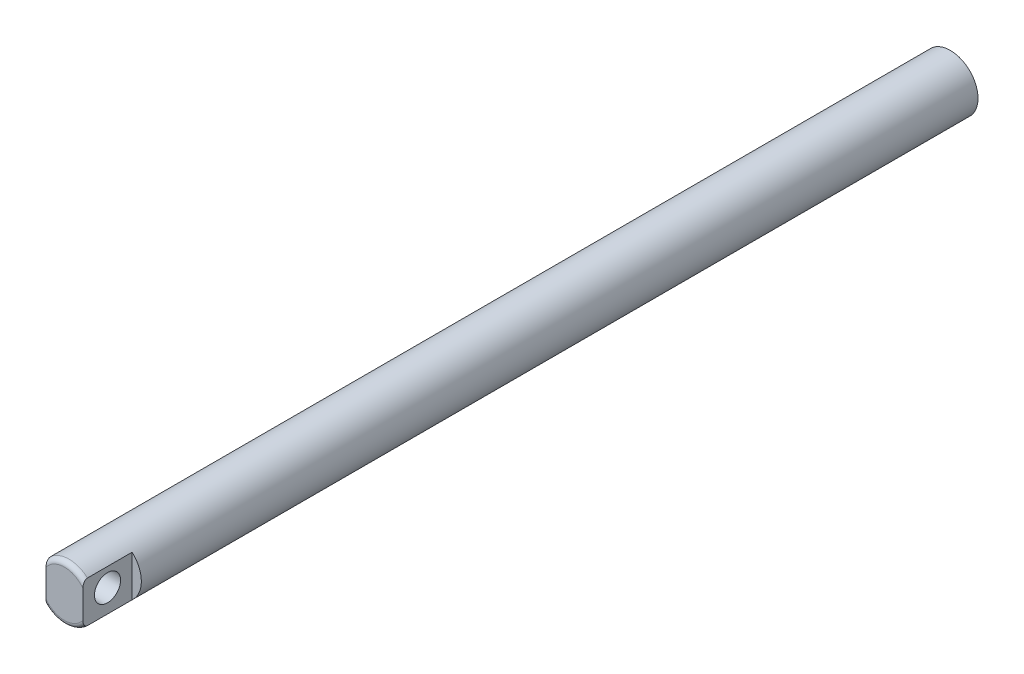
ISO-10303-21;
HEADER;
FILE_DESCRIPTION(('STEP AP214'),'2;1');
FILE_NAME('part.step','',(''),(''),'','','');
FILE_SCHEMA(('AUTOMOTIVE_DESIGN { 1 0 10303 214 1 1 1 1 }'));
ENDSEC;
DATA;
#1=APPLICATION_CONTEXT('core data for automotive mechanical design processes');
#2=APPLICATION_PROTOCOL_DEFINITION('international standard','automotive_design',2000,#1);
#3=PRODUCT_CONTEXT('',#1,'mechanical');
#4=PRODUCT('Part','Part','',(#3));
#5=PRODUCT_RELATED_PRODUCT_CATEGORY('part','',(#4));
#6=PRODUCT_DEFINITION_FORMATION('','',#4);
#7=PRODUCT_DEFINITION_CONTEXT('part definition',#1,'design');
#8=PRODUCT_DEFINITION('design','',#6,#7);
#9=PRODUCT_DEFINITION_SHAPE('','',#8);
#10=(LENGTH_UNIT() NAMED_UNIT(*) SI_UNIT(.MILLI.,.METRE.));
#11=(NAMED_UNIT(*) PLANE_ANGLE_UNIT() SI_UNIT($,.RADIAN.));
#12=(NAMED_UNIT(*) SI_UNIT($,.STERADIAN.) SOLID_ANGLE_UNIT());
#13=UNCERTAINTY_MEASURE_WITH_UNIT(LENGTH_MEASURE(1.E-05),#10,'distance_accuracy_value','');
#14=(GEOMETRIC_REPRESENTATION_CONTEXT(3) GLOBAL_UNCERTAINTY_ASSIGNED_CONTEXT((#13)) GLOBAL_UNIT_ASSIGNED_CONTEXT((#10,
#11,#12)) REPRESENTATION_CONTEXT('',''));
#15=CARTESIAN_POINT('',(0.,0.,0.));
#16=DIRECTION('',(0.,0.,1.));
#17=DIRECTION('',(1.,0.,0.));
#18=AXIS2_PLACEMENT_3D('',#15,#16,#17);
#19=CARTESIAN_POINT('',(0.,0.,144.));
#20=DIRECTION('',(0.,0.,-1.));
#21=DIRECTION('',(-1.00000000000001,0.,0.));
#22=AXIS2_PLACEMENT_3D('',#19,#20,#21);
#23=CYLINDRICAL_SURFACE('',#22,4.5);
#24=DIRECTION('',(0.,0.,-1.));
#25=VECTOR('',#24,1.);
#26=CARTESIAN_POINT('',(3.00000000000002,-3.35410196624971,144.));
#27=LINE('',#26,#25);
#28=CARTESIAN_POINT('',(3.00000000000002,-3.35410196624971,136.));
#29=VERTEX_POINT('',#28);
#30=CARTESIAN_POINT('',(3.00000000000002,-3.35410196624971,143.25));
#31=VERTEX_POINT('',#30);
#32=EDGE_CURVE('E101',#29,#31,#27,.F.);
#33=ORIENTED_EDGE('',*,*,#32,.T.);
#34=CARTESIAN_POINT('',(0.,0.,143.25));
#35=DIRECTION('',(0.,0.,1.));
#36=DIRECTION('',(1.00000000000001,0.,0.));
#37=AXIS2_PLACEMENT_3D('',#34,#35,#36);
#38=CIRCLE('',#37,4.5);
#39=CARTESIAN_POINT('',(-3.00000000000002,-3.35410196624969,143.25));
#40=VERTEX_POINT('',#39);
#41=EDGE_CURVE('E72',#31,#40,#38,.F.);
#42=ORIENTED_EDGE('',*,*,#41,.T.);
#43=DIRECTION('',(0.,0.,-1.));
#44=VECTOR('',#43,1.);
#45=CARTESIAN_POINT('',(-3.00000000000002,-3.35410196624969,144.));
#46=LINE('',#45,#44);
#47=CARTESIAN_POINT('',(-3.00000000000002,-3.35410196624969,136.));
#48=VERTEX_POINT('',#47);
#49=EDGE_CURVE('E214',#40,#48,#46,.T.);
#50=ORIENTED_EDGE('',*,*,#49,.T.);
#51=CARTESIAN_POINT('',(0.,0.,136.));
#52=DIRECTION('',(0.,0.,-1.));
#53=DIRECTION('',(-1.00000000000001,0.,0.));
#54=AXIS2_PLACEMENT_3D('',#51,#52,#53);
#55=CIRCLE('',#54,4.5);
#56=CARTESIAN_POINT('',(-3.00000000000002,3.35410196624971,136.));
#57=VERTEX_POINT('',#56);
#58=EDGE_CURVE('E124',#48,#57,#55,.T.);
#59=ORIENTED_EDGE('',*,*,#58,.T.);
#60=DIRECTION('',(0.,0.,-1.));
#61=VECTOR('',#60,1.);
#62=CARTESIAN_POINT('',(-3.00000000000002,3.35410196624971,144.));
#63=LINE('',#62,#61);
#64=CARTESIAN_POINT('',(-3.00000000000002,3.35410196624971,143.25));
#65=VERTEX_POINT('',#64);
#66=EDGE_CURVE('E192',#57,#65,#63,.F.);
#67=ORIENTED_EDGE('',*,*,#66,.T.);
#68=CARTESIAN_POINT('',(0.,0.,143.25));
#69=DIRECTION('',(0.,0.,1.));
#70=DIRECTION('',(1.00000000000001,0.,0.));
#71=AXIS2_PLACEMENT_3D('',#68,#69,#70);
#72=CIRCLE('',#71,4.5);
#73=CARTESIAN_POINT('',(3.00000000000002,3.35410196624973,143.25));
#74=VERTEX_POINT('',#73);
#75=EDGE_CURVE('E189',#65,#74,#72,.F.);
#76=ORIENTED_EDGE('',*,*,#75,.T.);
#77=DIRECTION('',(0.,0.,-1.));
#78=VECTOR('',#77,1.);
#79=CARTESIAN_POINT('',(3.00000000000002,3.35410196624973,144.));
#80=LINE('',#79,#78);
#81=CARTESIAN_POINT('',(3.00000000000002,3.35410196624973,136.));
#82=VERTEX_POINT('',#81);
#83=EDGE_CURVE('E109',#74,#82,#80,.T.);
#84=ORIENTED_EDGE('',*,*,#83,.T.);
#85=CARTESIAN_POINT('',(0.,0.,136.));
#86=DIRECTION('',(0.,0.,1.));
#87=DIRECTION('',(1.00000000000001,0.,0.));
#88=AXIS2_PLACEMENT_3D('',#85,#86,#87);
#89=CIRCLE('',#88,4.5);
#90=EDGE_CURVE('E114',#29,#82,#89,.T.);
#91=ORIENTED_EDGE('',*,*,#90,.F.);
#92=EDGE_LOOP('',(#33,#42,#50,#59,#67,#76,#84,#91));
#93=FACE_BOUND('',#92,.T.);
#94=CARTESIAN_POINT('',(0.,0.,0.));
#95=DIRECTION('',(0.,0.,1.));
#96=DIRECTION('',(1.00000000000001,0.,0.));
#97=AXIS2_PLACEMENT_3D('',#94,#95,#96);
#98=CIRCLE('',#97,4.5);
#99=CARTESIAN_POINT('',(4.50000000000003,0.,0.));
#100=VERTEX_POINT('',#99);
#101=EDGE_CURVE('E186',#100,#100,#98,.T.);
#102=ORIENTED_EDGE('',*,*,#101,.T.);
#103=EDGE_LOOP('',(#102));
#104=FACE_BOUND('',#103,.T.);
#105=ADVANCED_FACE('F48',(#93,#104),#23,.T.);
#106=CARTESIAN_POINT('',(0.,0.,144.));
#107=DIRECTION('',(0.,0.,1.));
#108=DIRECTION('',(1.00000000000001,0.,0.));
#109=AXIS2_PLACEMENT_3D('',#106,#107,#108);
#110=PLANE('',#109);
#111=DIRECTION('',(0.,1.00000000000001,0.));
#112=VECTOR('',#111,1.);
#113=CARTESIAN_POINT('',(-3.00000000000002,0.,144.));
#114=LINE('',#113,#112);
#115=CARTESIAN_POINT('',(-3.00000000000002,-2.25,144.));
#116=VERTEX_POINT('',#115);
#117=CARTESIAN_POINT('',(-3.00000000000002,2.25,144.));
#118=VERTEX_POINT('',#117);
#119=EDGE_CURVE('E182',#116,#118,#114,.T.);
#120=ORIENTED_EDGE('',*,*,#119,.F.);
#121=CARTESIAN_POINT('',(0.,0.,144.));
#122=DIRECTION('',(0.,0.,1.));
#123=DIRECTION('',(1.00000000000001,0.,0.));
#124=AXIS2_PLACEMENT_3D('',#121,#122,#123);
#125=CIRCLE('',#124,3.75);
#126=CARTESIAN_POINT('',(3.00000000000002,-2.25000000000001,144.));
#127=VERTEX_POINT('',#126);
#128=EDGE_CURVE('E122',#116,#127,#125,.T.);
#129=ORIENTED_EDGE('',*,*,#128,.T.);
#130=DIRECTION('',(0.,-1.00000000000001,0.));
#131=VECTOR('',#130,1.);
#132=CARTESIAN_POINT('',(3.00000000000002,0.,144.));
#133=LINE('',#132,#131);
#134=CARTESIAN_POINT('',(3.00000000000002,2.25000000000001,144.));
#135=VERTEX_POINT('',#134);
#136=EDGE_CURVE('E119',#135,#127,#133,.T.);
#137=ORIENTED_EDGE('',*,*,#136,.F.);
#138=CARTESIAN_POINT('',(0.,0.,144.));
#139=DIRECTION('',(0.,0.,1.));
#140=DIRECTION('',(1.00000000000001,0.,0.));
#141=AXIS2_PLACEMENT_3D('',#138,#139,#140);
#142=CIRCLE('',#141,3.75);
#143=EDGE_CURVE('E118',#135,#118,#142,.T.);
#144=ORIENTED_EDGE('',*,*,#143,.T.);
#145=EDGE_LOOP('',(#120,#129,#137,#144));
#146=FACE_BOUND('',#145,.T.);
#147=ADVANCED_FACE('F173',(#146),#110,.T.);
#148=CARTESIAN_POINT('',(0.,0.,0.));
#149=DIRECTION('',(0.,0.,1.));
#150=DIRECTION('',(1.00000000000001,0.,0.));
#151=AXIS2_PLACEMENT_3D('',#148,#149,#150);
#152=PLANE('',#151);
#153=ORIENTED_EDGE('',*,*,#101,.F.);
#154=EDGE_LOOP('',(#153));
#155=FACE_BOUND('',#154,.T.);
#156=ADVANCED_FACE('F174',(#155),#152,.F.);
#157=CARTESIAN_POINT('',(-4.50000000000002,4.50000000000002,136.));
#158=DIRECTION('',(0.,0.,-1.));
#159=DIRECTION('',(-1.00000000000001,0.,0.));
#160=AXIS2_PLACEMENT_3D('',#157,#158,#159);
#161=PLANE('',#160);
#162=ORIENTED_EDGE('',*,*,#58,.F.);
#163=DIRECTION('',(0.,1.00000000000001,0.));
#164=VECTOR('',#163,1.);
#165=CARTESIAN_POINT('',(-3.00000000000003,4.50000000000002,136.));
#166=LINE('',#165,#164);
#167=EDGE_CURVE('E195',#48,#57,#166,.T.);
#168=ORIENTED_EDGE('',*,*,#167,.T.);
#169=EDGE_LOOP('',(#162,#168));
#170=FACE_BOUND('',#169,.T.);
#171=ADVANCED_FACE('F154',(#170),#161,.F.);
#172=CARTESIAN_POINT('',(-3.00000000000002,0.,0.));
#173=DIRECTION('',(1.00000000000001,0.,0.));
#174=DIRECTION('',(0.,0.,-1.));
#175=AXIS2_PLACEMENT_3D('',#172,#173,#174);
#176=PLANE('',#175);
#177=CARTESIAN_POINT('',(-3.00000000000002,0.354101966249683,140.));
#178=DIRECTION('',(1.00000000000001,0.,0.));
#179=DIRECTION('',(0.,0.,-1.));
#180=AXIS2_PLACEMENT_3D('',#177,#178,#179);
#181=CIRCLE('',#180,2.12499999999998);
#182=CARTESIAN_POINT('',(-3.00000000000002,0.354101966249683,137.875));
#183=VERTEX_POINT('',#182);
#184=EDGE_CURVE('E115',#183,#183,#181,.T.);
#185=ORIENTED_EDGE('',*,*,#184,.T.);
#186=EDGE_LOOP('',(#185));
#187=FACE_BOUND('',#186,.T.);
#188=ORIENTED_EDGE('',*,*,#49,.F.);
#189=CARTESIAN_POINT('',(-3.00000000000002,-3.35410196624969,143.25));
#190=CARTESIAN_POINT('',(-3.00000000000002,-3.35410409218239,143.26713394575));
#191=CARTESIAN_POINT('',(-3.00000000000002,-3.35331357338606,143.284258126643));
#192=CARTESIAN_POINT('',(-3.00000000000002,-3.35017527587869,143.318354019342));
#193=CARTESIAN_POINT('',(-3.00000000000002,-3.34782834599391,143.335325809149));
#194=CARTESIAN_POINT('',(-3.00000000000002,-3.33854076166139,143.385586394569));
#195=CARTESIAN_POINT('',(-3.00000000000002,-3.32935233419234,143.418483534486));
#196=CARTESIAN_POINT('',(-3.00000000000002,-3.30556462774004,143.482147274781));
#197=CARTESIAN_POINT('',(-3.00000000000002,-3.29097504422241,143.512917576245));
#198=CARTESIAN_POINT('',(-3.00000000000002,-3.25715435805243,143.571831219658));
#199=CARTESIAN_POINT('',(-3.00000000000002,-3.23791524356406,143.599969909588));
#200=CARTESIAN_POINT('',(-3.00000000000002,-3.18879324953275,143.661837329213));
#201=CARTESIAN_POINT('',(-3.00000000000002,-3.15748049021479,143.694429928147));
#202=CARTESIAN_POINT('',(-3.00000000000002,-3.08999997635573,143.754070445805));
#203=CARTESIAN_POINT('',(-3.00000000000002,-3.05382676321564,143.781112042815));
#204=CARTESIAN_POINT('',(-3.00000000000002,-2.96380743753313,143.839009797214));
#205=CARTESIAN_POINT('',(-3.00000000000002,-2.90843089047516,143.867476240524));
#206=CARTESIAN_POINT('',(-3.00000000000002,-2.79376146981513,143.915365317825));
#207=CARTESIAN_POINT('',(-3.00000000000002,-2.73445300420577,143.934749141929));
#208=CARTESIAN_POINT('',(-3.00000000000002,-2.60458768682221,143.967938386785));
#209=CARTESIAN_POINT('',(-3.00000000000002,-2.53370532405621,143.98042472903));
#210=CARTESIAN_POINT('',(-3.00000000000002,-2.39178943876484,143.9963813353));
#211=CARTESIAN_POINT('',(-3.00000000000002,-2.32076874218727,143.999961718859));
#212=CARTESIAN_POINT('',(-3.00000000000002,-2.25000000000001,144.));
#213=B_SPLINE_CURVE_WITH_KNOTS('',3,(#189,#190,#191,#192,#193,#194,#195,#196,#197,#198,#199,
#200,#201,#202,#203,#204,#205,#206,#207,#208,#209,#210,#211,#212),.UNSPECIFIED.,.F.,.F.,(4,2,2,
2,2,2,2,2,2,2,2,4),(0.,0.0513648705172206,0.102701750977417,0.204597814804919,0.306311847795476,
0.408202414858006,0.543052411009037,0.678055138233685,0.86382670199868,1.05038498436757,
1.26567804977374,1.47829554458073),.UNSPECIFIED.);
#214=EDGE_CURVE('E13',#40,#116,#213,.T.);
#215=ORIENTED_EDGE('',*,*,#214,.T.);
#216=ORIENTED_EDGE('',*,*,#119,.T.);
#217=CARTESIAN_POINT('',(-3.00000000000002,2.25,144.));
#218=CARTESIAN_POINT('',(-3.00000000000002,2.29889798200293,143.999990176903));
#219=CARTESIAN_POINT('',(-3.00000000000002,2.34784023289014,143.998276465641));
#220=CARTESIAN_POINT('',(-3.00000000000002,2.44565423443376,143.990922219171));
#221=CARTESIAN_POINT('',(-3.00000000000002,2.49452456091406,143.98526317975));
#222=CARTESIAN_POINT('',(-3.00000000000002,2.59229137550159,143.969371900865));
#223=CARTESIAN_POINT('',(-3.00000000000002,2.6411773471233,143.959072603037));
#224=CARTESIAN_POINT('',(-3.00000000000002,2.73748523865692,143.933310130579));
#225=CARTESIAN_POINT('',(-3.00000000000003,2.78491008205438,143.917858113161));
#226=CARTESIAN_POINT('',(-3.00000000000003,2.87723104963996,143.881272998081));
#227=CARTESIAN_POINT('',(-3.00000000000002,2.92214046340747,143.860174019212));
#228=CARTESIAN_POINT('',(-3.00000000000002,3.00831023393182,143.81176608045));
#229=CARTESIAN_POINT('',(-3.00000000000002,3.04958512953415,143.784483584441));
#230=CARTESIAN_POINT('',(-3.00000000000002,3.12081012897214,143.72816346187));
#231=CARTESIAN_POINT('',(-3.00000000000002,3.15151800353427,143.700091133285));
#232=CARTESIAN_POINT('',(-3.00000000000002,3.20796620361711,143.639269238338));
#233=CARTESIAN_POINT('',(-3.00000000000002,3.23370859700662,143.606521628922));
#234=CARTESIAN_POINT('',(-3.00000000000002,3.27474706058668,143.54295752116));
#235=CARTESIAN_POINT('',(-3.00000000000002,3.29108410503345,143.512814278131));
#236=CARTESIAN_POINT('',(-3.00000000000002,3.31850121169554,143.450245124117));
#237=CARTESIAN_POINT('',(-3.00000000000002,3.32959073299796,143.41782344235));
#238=CARTESIAN_POINT('',(-3.00000000000002,3.34312651483812,143.362687978358));
#239=CARTESIAN_POINT('',(-3.00000000000002,3.34722464196499,143.340369521971));
#240=CARTESIAN_POINT('',(-3.00000000000002,3.35271968930121,143.29537327786));
#241=CARTESIAN_POINT('',(-3.00000000000002,3.35411297564744,143.272695047947));
#242=CARTESIAN_POINT('',(-3.00000000000002,3.35410196624971,143.25));
#243=B_SPLINE_CURVE_WITH_KNOTS('',3,(#217,#218,#219,#220,#221,#222,#223,#224,#225,#226,#227,
#228,#229,#230,#231,#232,#233,#234,#235,#236,#237,#238,#239,#240,#241,#242),.UNSPECIFIED.,.F.,
.F.,(4,2,2,2,2,2,2,2,2,2,2,2,4),(0.,0.146731141001325,0.294155145005141,0.443781592431154,
0.593086134176473,0.741508186813442,0.889306639638895,1.01365472547,1.13795091435245,
1.24038729004289,1.34263830573242,1.41055922321019,1.47857132719339),.UNSPECIFIED.);
#244=EDGE_CURVE('E58',#118,#65,#243,.T.);
#245=ORIENTED_EDGE('',*,*,#244,.T.);
#246=ORIENTED_EDGE('',*,*,#66,.F.);
#247=ORIENTED_EDGE('',*,*,#167,.F.);
#248=EDGE_LOOP('',(#188,#215,#216,#245,#246,#247));
#249=FACE_BOUND('',#248,.T.);
#250=ADVANCED_FACE('F150',(#187,#249),#176,.F.);
#251=CARTESIAN_POINT('',(4.50000000000002,4.50000000000004,136.));
#252=DIRECTION('',(0.,0.,1.));
#253=DIRECTION('',(1.00000000000001,0.,0.));
#254=AXIS2_PLACEMENT_3D('',#251,#252,#253);
#255=PLANE('',#254);
#256=ORIENTED_EDGE('',*,*,#90,.T.);
#257=DIRECTION('',(0.,1.00000000000001,0.));
#258=VECTOR('',#257,1.);
#259=CARTESIAN_POINT('',(3.00000000000002,4.50000000000004,136.));
#260=LINE('',#259,#258);
#261=EDGE_CURVE('E106',#29,#82,#260,.T.);
#262=ORIENTED_EDGE('',*,*,#261,.F.);
#263=EDGE_LOOP('',(#256,#262));
#264=FACE_BOUND('',#263,.T.);
#265=ADVANCED_FACE('F113',(#264),#255,.T.);
#266=CARTESIAN_POINT('',(3.00000000000002,0.,0.));
#267=DIRECTION('',(-1.00000000000001,0.,0.));
#268=DIRECTION('',(0.,0.,-1.));
#269=AXIS2_PLACEMENT_3D('',#266,#267,#268);
#270=PLANE('',#269);
#271=CARTESIAN_POINT('',(3.00000000000002,0.354101966249685,140.));
#272=DIRECTION('',(-1.00000000000001,0.,0.));
#273=DIRECTION('',(0.,0.,1.));
#274=AXIS2_PLACEMENT_3D('',#271,#272,#273);
#275=CIRCLE('',#274,2.12499999999998);
#276=CARTESIAN_POINT('',(3.00000000000002,0.354101966249685,142.125));
#277=VERTEX_POINT('',#276);
#278=EDGE_CURVE('E53',#277,#277,#275,.T.);
#279=ORIENTED_EDGE('',*,*,#278,.T.);
#280=EDGE_LOOP('',(#279));
#281=FACE_BOUND('',#280,.T.);
#282=ORIENTED_EDGE('',*,*,#136,.T.);
#283=CARTESIAN_POINT('',(3.00000000000002,-2.25000000000001,144.));
#284=CARTESIAN_POINT('',(3.00000000000002,-2.29889798200294,143.999990176903));
#285=CARTESIAN_POINT('',(3.00000000000002,-2.34784023289015,143.998276465641));
#286=CARTESIAN_POINT('',(3.00000000000002,-2.44565423443376,143.990922219171));
#287=CARTESIAN_POINT('',(3.00000000000002,-2.49452456091406,143.98526317975));
#288=CARTESIAN_POINT('',(3.00000000000002,-2.59229137550159,143.969371900865));
#289=CARTESIAN_POINT('',(3.00000000000002,-2.64117734712329,143.959072603037));
#290=CARTESIAN_POINT('',(3.00000000000002,-2.73748523865691,143.933310130579));
#291=CARTESIAN_POINT('',(3.00000000000002,-2.78491008205437,143.917858113161));
#292=CARTESIAN_POINT('',(3.00000000000002,-2.87723104963996,143.881272998081));
#293=CARTESIAN_POINT('',(3.00000000000002,-2.92214046340747,143.860174019212));
#294=CARTESIAN_POINT('',(3.00000000000002,-3.00831023393183,143.81176608045));
#295=CARTESIAN_POINT('',(3.00000000000002,-3.04958512953415,143.784483584441));
#296=CARTESIAN_POINT('',(3.00000000000002,-3.12081012897214,143.72816346187));
#297=CARTESIAN_POINT('',(3.00000000000002,-3.15151800353427,143.700091133285));
#298=CARTESIAN_POINT('',(3.00000000000002,-3.20796620361711,143.639269238338));
#299=CARTESIAN_POINT('',(3.00000000000002,-3.23370859700662,143.606521628922));
#300=CARTESIAN_POINT('',(3.00000000000002,-3.27474706058668,143.54295752116));
#301=CARTESIAN_POINT('',(3.00000000000002,-3.29108410503345,143.512814278131));
#302=CARTESIAN_POINT('',(3.00000000000002,-3.31850121169554,143.450245124117));
#303=CARTESIAN_POINT('',(3.00000000000002,-3.32959073299796,143.41782344235));
#304=CARTESIAN_POINT('',(3.00000000000002,-3.34312651483812,143.362687978358));
#305=CARTESIAN_POINT('',(3.00000000000002,-3.34722464196499,143.340369521971));
#306=CARTESIAN_POINT('',(3.00000000000002,-3.35271968930121,143.29537327786));
#307=CARTESIAN_POINT('',(3.00000000000002,-3.35411297564744,143.272695047947));
#308=CARTESIAN_POINT('',(3.00000000000002,-3.35410196624971,143.25));
#309=B_SPLINE_CURVE_WITH_KNOTS('',3,(#283,#284,#285,#286,#287,#288,#289,#290,#291,#292,#293,
#294,#295,#296,#297,#298,#299,#300,#301,#302,#303,#304,#305,#306,#307,#308),.UNSPECIFIED.,.F.,
.F.,(4,2,2,2,2,2,2,2,2,2,2,2,4),(0.,0.14673114100132,0.294155145005128,0.443781592431136,
0.593086134176452,0.741508186813438,0.889306639638884,1.01365472546999,1.13795091435244,
1.24038729004288,1.34263830573241,1.41055922321018,1.47857132719338),.UNSPECIFIED.);
#310=EDGE_CURVE('E107',#127,#31,#309,.T.);
#311=ORIENTED_EDGE('',*,*,#310,.T.);
#312=ORIENTED_EDGE('',*,*,#32,.F.);
#313=ORIENTED_EDGE('',*,*,#261,.T.);
#314=ORIENTED_EDGE('',*,*,#83,.F.);
#315=CARTESIAN_POINT('',(3.00000000000002,3.35410196624973,143.25));
#316=CARTESIAN_POINT('',(3.00000000000002,3.3541040921824,143.26713394575));
#317=CARTESIAN_POINT('',(3.00000000000002,3.35331357338606,143.284258126643));
#318=CARTESIAN_POINT('',(3.00000000000002,3.35017527587868,143.318354019342));
#319=CARTESIAN_POINT('',(3.00000000000002,3.3478283459939,143.335325809149));
#320=CARTESIAN_POINT('',(3.00000000000002,3.3385407616614,143.385586394569));
#321=CARTESIAN_POINT('',(3.00000000000002,3.32935233419237,143.418483534486));
#322=CARTESIAN_POINT('',(3.00000000000002,3.30556462774009,143.482147274781));
#323=CARTESIAN_POINT('',(3.00000000000002,3.29097504422243,143.512917576245));
#324=CARTESIAN_POINT('',(3.00000000000002,3.25715435805245,143.571831219658));
#325=CARTESIAN_POINT('',(3.00000000000002,3.23791524356409,143.599969909588));
#326=CARTESIAN_POINT('',(3.00000000000002,3.18879324953279,143.661837329213));
#327=CARTESIAN_POINT('',(3.00000000000002,3.15748049021481,143.694429928147));
#328=CARTESIAN_POINT('',(3.00000000000002,3.08999997635575,143.754070445805));
#329=CARTESIAN_POINT('',(3.00000000000002,3.05382676321567,143.781112042815));
#330=CARTESIAN_POINT('',(3.00000000000002,2.96380743753318,143.839009797214));
#331=CARTESIAN_POINT('',(3.00000000000002,2.9084308904752,143.867476240524));
#332=CARTESIAN_POINT('',(3.00000000000002,2.79376146981517,143.915365317825));
#333=CARTESIAN_POINT('',(3.00000000000002,2.73445300420581,143.934749141929));
#334=CARTESIAN_POINT('',(3.00000000000002,2.60458768682224,143.967938386785));
#335=CARTESIAN_POINT('',(3.00000000000002,2.53370532405624,143.98042472903));
#336=CARTESIAN_POINT('',(3.00000000000002,2.39178943876485,143.9963813353));
#337=CARTESIAN_POINT('',(3.00000000000002,2.32076874218728,143.999961718859));
#338=CARTESIAN_POINT('',(3.00000000000002,2.25000000000001,144.));
#339=B_SPLINE_CURVE_WITH_KNOTS('',3,(#315,#316,#317,#318,#319,#320,#321,#322,#323,#324,#325,
#326,#327,#328,#329,#330,#331,#332,#333,#334,#335,#336,#337,#338),.UNSPECIFIED.,.F.,.F.,(4,2,2,
2,2,2,2,2,2,2,2,4),(0.,0.0513648705172504,0.102701750977419,0.20459781480491,0.306311847795478,
0.408202414857995,0.543052411009018,0.678055138233669,0.863826701998665,1.05038498436756,
1.26567804977374,1.47829554458075),.UNSPECIFIED.);
#340=EDGE_CURVE('E130',#74,#135,#339,.T.);
#341=ORIENTED_EDGE('',*,*,#340,.T.);
#342=EDGE_LOOP('',(#282,#311,#312,#313,#314,#341));
#343=FACE_BOUND('',#342,.T.);
#344=ADVANCED_FACE('F104',(#281,#343),#270,.F.);
#345=CARTESIAN_POINT('',(0.,0.,143.25));
#346=DIRECTION('',(0.,0.,1.));
#347=DIRECTION('',(1.00000000000001,0.,0.));
#348=AXIS2_PLACEMENT_3D('',#345,#346,#347);
#349=TOROIDAL_SURFACE('',#348,3.75,0.75);
#350=ORIENTED_EDGE('',*,*,#214,.F.);
#351=ORIENTED_EDGE('',*,*,#41,.F.);
#352=ORIENTED_EDGE('',*,*,#310,.F.);
#353=ORIENTED_EDGE('',*,*,#128,.F.);
#354=EDGE_LOOP('',(#350,#351,#352,#353));
#355=FACE_BOUND('',#354,.T.);
#356=ADVANCED_FACE('F144',(#355),#349,.T.);
#357=CARTESIAN_POINT('',(0.,0.,143.25));
#358=DIRECTION('',(0.,0.,1.));
#359=DIRECTION('',(1.00000000000001,0.,0.));
#360=AXIS2_PLACEMENT_3D('',#357,#358,#359);
#361=TOROIDAL_SURFACE('',#360,3.75,0.75);
#362=ORIENTED_EDGE('',*,*,#340,.F.);
#363=ORIENTED_EDGE('',*,*,#75,.F.);
#364=ORIENTED_EDGE('',*,*,#244,.F.);
#365=ORIENTED_EDGE('',*,*,#143,.F.);
#366=EDGE_LOOP('',(#362,#363,#364,#365));
#367=FACE_BOUND('',#366,.T.);
#368=ADVANCED_FACE('F50',(#367),#361,.T.);
#369=CARTESIAN_POINT('',(-4.50000000000001,0.354101966249683,140.));
#370=DIRECTION('',(1.00000000000001,0.,0.));
#371=DIRECTION('',(0.,0.,-1.));
#372=AXIS2_PLACEMENT_3D('',#369,#370,#371);
#373=CYLINDRICAL_SURFACE('',#372,2.12499999999998);
#374=ORIENTED_EDGE('',*,*,#278,.F.);
#375=EDGE_LOOP('',(#374));
#376=FACE_BOUND('',#375,.T.);
#377=ORIENTED_EDGE('',*,*,#184,.F.);
#378=EDGE_LOOP('',(#377));
#379=FACE_BOUND('',#378,.T.);
#380=ADVANCED_FACE('F146',(#376,#379),#373,.F.);
#381=CLOSED_SHELL('',(#105,#147,#156,#171,#250,#265,#344,#356,#368,#380));
#382=MANIFOLD_SOLID_BREP('B2',#381);
#383=ADVANCED_BREP_SHAPE_REPRESENTATION('',(#18,#382),#14);
#384=SHAPE_DEFINITION_REPRESENTATION(#9,#383);
ENDSEC;
END-ISO-10303-21;
